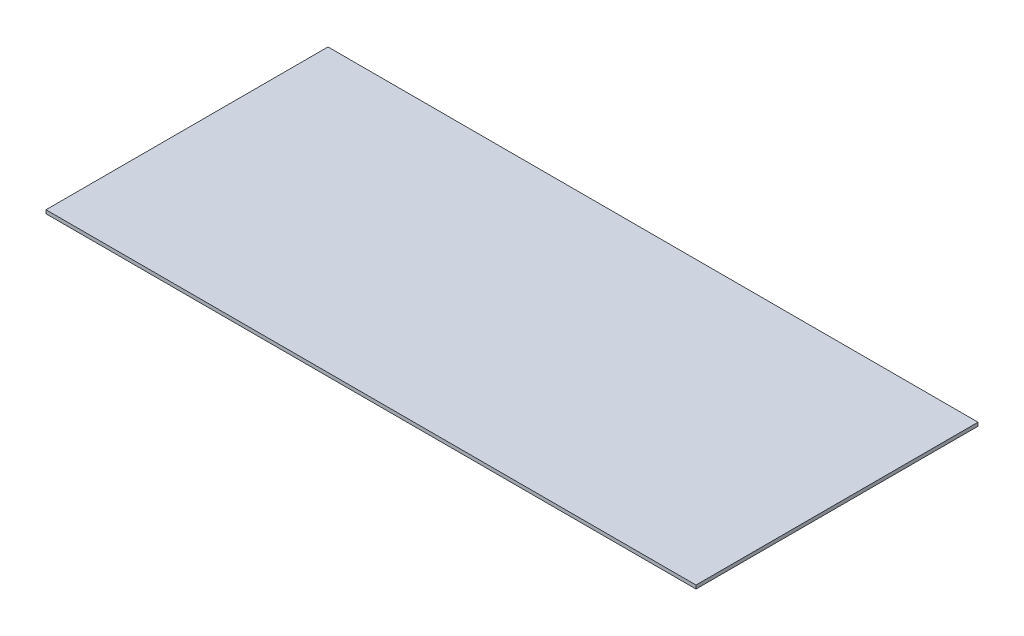
ISO-10303-21;
HEADER;
FILE_DESCRIPTION(('STEP AP214'),'2;1');
FILE_NAME('part.step','',(''),(''),'','','');
FILE_SCHEMA(('AUTOMOTIVE_DESIGN { 1 0 10303 214 1 1 1 1 }'));
ENDSEC;
DATA;
#1=APPLICATION_CONTEXT('core data for automotive mechanical design processes');
#2=APPLICATION_PROTOCOL_DEFINITION('international standard','automotive_design',2000,#1);
#3=PRODUCT_CONTEXT('',#1,'mechanical');
#4=PRODUCT('Part','Part','',(#3));
#5=PRODUCT_RELATED_PRODUCT_CATEGORY('part','',(#4));
#6=PRODUCT_DEFINITION_FORMATION('','',#4);
#7=PRODUCT_DEFINITION_CONTEXT('part definition',#1,'design');
#8=PRODUCT_DEFINITION('design','',#6,#7);
#9=PRODUCT_DEFINITION_SHAPE('','',#8);
#10=(LENGTH_UNIT() NAMED_UNIT(*) SI_UNIT(.MILLI.,.METRE.));
#11=(NAMED_UNIT(*) PLANE_ANGLE_UNIT() SI_UNIT($,.RADIAN.));
#12=(NAMED_UNIT(*) SI_UNIT($,.STERADIAN.) SOLID_ANGLE_UNIT());
#13=UNCERTAINTY_MEASURE_WITH_UNIT(LENGTH_MEASURE(1.E-05),#10,'distance_accuracy_value','');
#14=(GEOMETRIC_REPRESENTATION_CONTEXT(3) GLOBAL_UNCERTAINTY_ASSIGNED_CONTEXT((#13)) GLOBAL_UNIT_ASSIGNED_CONTEXT((#10,
#11,#12)) REPRESENTATION_CONTEXT('',''));
#15=CARTESIAN_POINT('',(0.,0.,0.));
#16=DIRECTION('',(0.,0.,1.));
#17=DIRECTION('',(1.,0.,0.));
#18=AXIS2_PLACEMENT_3D('',#15,#16,#17);
#19=CARTESIAN_POINT('',(-461.,5.,200.));
#20=DIRECTION('',(1.,0.,0.));
#21=DIRECTION('',(0.,0.,-1.));
#22=AXIS2_PLACEMENT_3D('',#19,#20,#21);
#23=PLANE('',#22);
#24=DIRECTION('',(0.,0.,1.));
#25=VECTOR('',#24,1.);
#26=CARTESIAN_POINT('',(-461.,0.,200.));
#27=LINE('',#26,#25);
#28=CARTESIAN_POINT('',(-461.,0.,-200.));
#29=VERTEX_POINT('',#28);
#30=CARTESIAN_POINT('',(-461.,0.,200.));
#31=VERTEX_POINT('',#30);
#32=EDGE_CURVE('E98',#29,#31,#27,.T.);
#33=ORIENTED_EDGE('',*,*,#32,.T.);
#34=DIRECTION('',(0.,-1.,0.));
#35=VECTOR('',#34,1.);
#36=CARTESIAN_POINT('',(-461.,5.,200.));
#37=LINE('',#36,#35);
#38=CARTESIAN_POINT('',(-461.,5.,200.));
#39=VERTEX_POINT('',#38);
#40=EDGE_CURVE('E11',#39,#31,#37,.T.);
#41=ORIENTED_EDGE('',*,*,#40,.F.);
#42=DIRECTION('',(0.,0.,1.));
#43=VECTOR('',#42,1.);
#44=CARTESIAN_POINT('',(-461.,5.,200.));
#45=LINE('',#44,#43);
#46=CARTESIAN_POINT('',(-461.,5.,-200.));
#47=VERTEX_POINT('',#46);
#48=EDGE_CURVE('E86',#47,#39,#45,.T.);
#49=ORIENTED_EDGE('',*,*,#48,.F.);
#50=DIRECTION('',(0.,-1.,0.));
#51=VECTOR('',#50,1.);
#52=CARTESIAN_POINT('',(-461.,5.,-200.));
#53=LINE('',#52,#51);
#54=EDGE_CURVE('E94',#47,#29,#53,.T.);
#55=ORIENTED_EDGE('',*,*,#54,.T.);
#56=EDGE_LOOP('',(#33,#41,#49,#55));
#57=FACE_BOUND('',#56,.T.);
#58=ADVANCED_FACE('F35',(#57),#23,.F.);
#59=CARTESIAN_POINT('',(461.,5.,200.));
#60=DIRECTION('',(0.,0.,-1.));
#61=DIRECTION('',(-1.,0.,0.));
#62=AXIS2_PLACEMENT_3D('',#59,#60,#61);
#63=PLANE('',#62);
#64=DIRECTION('',(1.,0.,0.));
#65=VECTOR('',#64,1.);
#66=CARTESIAN_POINT('',(461.,0.,200.));
#67=LINE('',#66,#65);
#68=CARTESIAN_POINT('',(461.,0.,200.));
#69=VERTEX_POINT('',#68);
#70=EDGE_CURVE('E90',#31,#69,#67,.T.);
#71=ORIENTED_EDGE('',*,*,#70,.T.);
#72=DIRECTION('',(0.,-1.,0.));
#73=VECTOR('',#72,1.);
#74=CARTESIAN_POINT('',(461.,5.,200.));
#75=LINE('',#74,#73);
#76=CARTESIAN_POINT('',(461.,5.,200.));
#77=VERTEX_POINT('',#76);
#78=EDGE_CURVE('E43',#77,#69,#75,.T.);
#79=ORIENTED_EDGE('',*,*,#78,.F.);
#80=DIRECTION('',(1.,0.,0.));
#81=VECTOR('',#80,1.);
#82=CARTESIAN_POINT('',(461.,5.,200.));
#83=LINE('',#82,#81);
#84=EDGE_CURVE('E81',#39,#77,#83,.T.);
#85=ORIENTED_EDGE('',*,*,#84,.F.);
#86=ORIENTED_EDGE('',*,*,#40,.T.);
#87=EDGE_LOOP('',(#71,#79,#85,#86));
#88=FACE_BOUND('',#87,.T.);
#89=ADVANCED_FACE('F89',(#88),#63,.F.);
#90=CARTESIAN_POINT('',(461.,5.,200.));
#91=DIRECTION('',(-1.,0.,0.));
#92=DIRECTION('',(0.,0.,1.));
#93=AXIS2_PLACEMENT_3D('',#90,#91,#92);
#94=PLANE('',#93);
#95=DIRECTION('',(0.,0.,-1.));
#96=VECTOR('',#95,1.);
#97=CARTESIAN_POINT('',(461.,0.,200.));
#98=LINE('',#97,#96);
#99=CARTESIAN_POINT('',(461.,0.,-200.));
#100=VERTEX_POINT('',#99);
#101=EDGE_CURVE('E68',#69,#100,#98,.T.);
#102=ORIENTED_EDGE('',*,*,#101,.T.);
#103=DIRECTION('',(0.,-1.,0.));
#104=VECTOR('',#103,1.);
#105=CARTESIAN_POINT('',(461.,5.,-200.));
#106=LINE('',#105,#104);
#107=CARTESIAN_POINT('',(461.,5.,-200.));
#108=VERTEX_POINT('',#107);
#109=EDGE_CURVE('E91',#108,#100,#106,.T.);
#110=ORIENTED_EDGE('',*,*,#109,.F.);
#111=DIRECTION('',(0.,0.,-1.));
#112=VECTOR('',#111,1.);
#113=CARTESIAN_POINT('',(461.,5.,200.));
#114=LINE('',#113,#112);
#115=EDGE_CURVE('E84',#77,#108,#114,.T.);
#116=ORIENTED_EDGE('',*,*,#115,.F.);
#117=ORIENTED_EDGE('',*,*,#78,.T.);
#118=EDGE_LOOP('',(#102,#110,#116,#117));
#119=FACE_BOUND('',#118,.T.);
#120=ADVANCED_FACE('F92',(#119),#94,.F.);
#121=CARTESIAN_POINT('',(461.,5.,-200.));
#122=DIRECTION('',(0.,0.,1.));
#123=DIRECTION('',(1.,0.,0.));
#124=AXIS2_PLACEMENT_3D('',#121,#122,#123);
#125=PLANE('',#124);
#126=DIRECTION('',(-1.,0.,0.));
#127=VECTOR('',#126,1.);
#128=CARTESIAN_POINT('',(461.,0.,-200.));
#129=LINE('',#128,#127);
#130=EDGE_CURVE('E74',#100,#29,#129,.T.);
#131=ORIENTED_EDGE('',*,*,#130,.T.);
#132=ORIENTED_EDGE('',*,*,#54,.F.);
#133=DIRECTION('',(-1.,0.,0.));
#134=VECTOR('',#133,1.);
#135=CARTESIAN_POINT('',(461.,5.,-200.));
#136=LINE('',#135,#134);
#137=EDGE_CURVE('E51',#108,#47,#136,.T.);
#138=ORIENTED_EDGE('',*,*,#137,.F.);
#139=ORIENTED_EDGE('',*,*,#109,.T.);
#140=EDGE_LOOP('',(#131,#132,#138,#139));
#141=FACE_BOUND('',#140,.T.);
#142=ADVANCED_FACE('F105',(#141),#125,.F.);
#143=CARTESIAN_POINT('',(-461.,5.,-200.));
#144=DIRECTION('',(0.,1.,0.));
#145=DIRECTION('',(0.,0.,1.));
#146=AXIS2_PLACEMENT_3D('',#143,#144,#145);
#147=PLANE('',#146);
#148=ORIENTED_EDGE('',*,*,#48,.T.);
#149=ORIENTED_EDGE('',*,*,#84,.T.);
#150=ORIENTED_EDGE('',*,*,#115,.T.);
#151=ORIENTED_EDGE('',*,*,#137,.T.);
#152=EDGE_LOOP('',(#148,#149,#150,#151));
#153=FACE_BOUND('',#152,.T.);
#154=ADVANCED_FACE('F82',(#153),#147,.T.);
#155=CARTESIAN_POINT('',(-461.,0.,-200.));
#156=DIRECTION('',(0.,1.,0.));
#157=DIRECTION('',(0.,0.,1.));
#158=AXIS2_PLACEMENT_3D('',#155,#156,#157);
#159=PLANE('',#158);
#160=ORIENTED_EDGE('',*,*,#32,.F.);
#161=ORIENTED_EDGE('',*,*,#130,.F.);
#162=ORIENTED_EDGE('',*,*,#101,.F.);
#163=ORIENTED_EDGE('',*,*,#70,.F.);
#164=EDGE_LOOP('',(#160,#161,#162,#163));
#165=FACE_BOUND('',#164,.T.);
#166=ADVANCED_FACE('F108',(#165),#159,.F.);
#167=CLOSED_SHELL('',(#58,#89,#120,#142,#154,#166));
#168=MANIFOLD_SOLID_BREP('B2',#167);
#169=ADVANCED_BREP_SHAPE_REPRESENTATION('',(#18,#168),#14);
#170=SHAPE_DEFINITION_REPRESENTATION(#9,#169);
ENDSEC;
END-ISO-10303-21;
